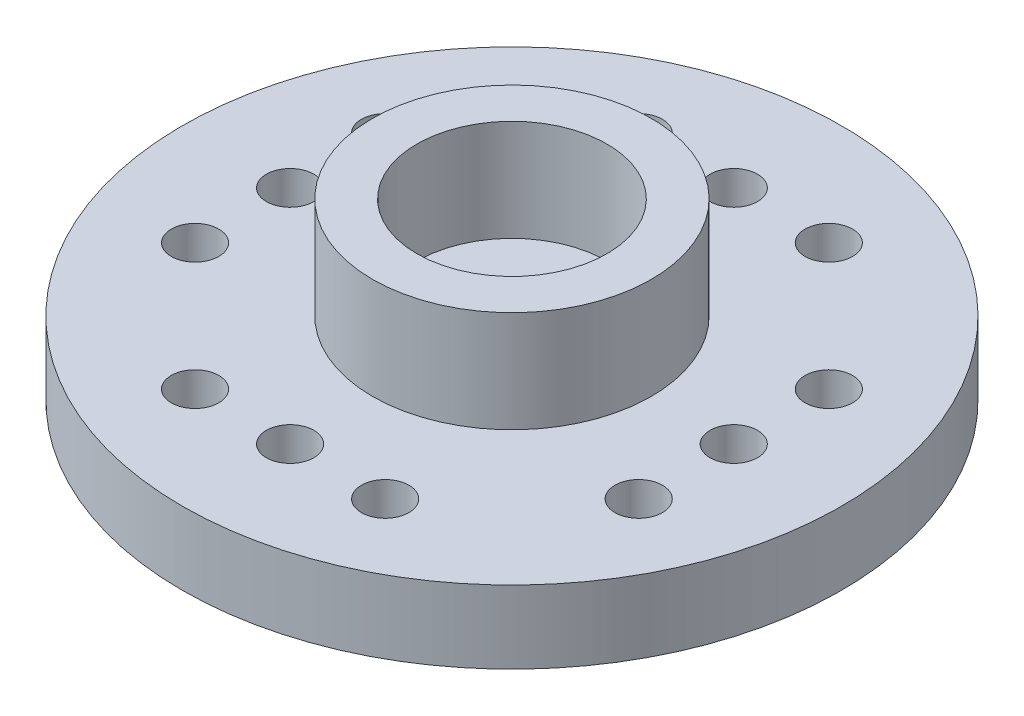
ISO-10303-21;
HEADER;
FILE_DESCRIPTION(('STEP AP214'),'2;1');
FILE_NAME('part.step','',(''),(''),'','','');
FILE_SCHEMA(('AUTOMOTIVE_DESIGN { 1 0 10303 214 1 1 1 1 }'));
ENDSEC;
DATA;
#1=APPLICATION_CONTEXT('core data for automotive mechanical design processes');
#2=APPLICATION_PROTOCOL_DEFINITION('international standard','automotive_design',2000,#1);
#3=PRODUCT_CONTEXT('',#1,'mechanical');
#4=PRODUCT('Part','Part','',(#3));
#5=PRODUCT_RELATED_PRODUCT_CATEGORY('part','',(#4));
#6=PRODUCT_DEFINITION_FORMATION('','',#4);
#7=PRODUCT_DEFINITION_CONTEXT('part definition',#1,'design');
#8=PRODUCT_DEFINITION('design','',#6,#7);
#9=PRODUCT_DEFINITION_SHAPE('','',#8);
#10=(LENGTH_UNIT() NAMED_UNIT(*) SI_UNIT(.MILLI.,.METRE.));
#11=(NAMED_UNIT(*) PLANE_ANGLE_UNIT() SI_UNIT($,.RADIAN.));
#12=(NAMED_UNIT(*) SI_UNIT($,.STERADIAN.) SOLID_ANGLE_UNIT());
#13=UNCERTAINTY_MEASURE_WITH_UNIT(LENGTH_MEASURE(1.E-05),#10,'distance_accuracy_value','');
#14=(GEOMETRIC_REPRESENTATION_CONTEXT(3) GLOBAL_UNCERTAINTY_ASSIGNED_CONTEXT((#13)) GLOBAL_UNIT_ASSIGNED_CONTEXT((#10,
#11,#12)) REPRESENTATION_CONTEXT('',''));
#15=CARTESIAN_POINT('',(0.,0.,0.));
#16=DIRECTION('',(0.,0.,1.));
#17=DIRECTION('',(1.,0.,0.));
#18=AXIS2_PLACEMENT_3D('',#15,#16,#17);
#19=CARTESIAN_POINT('',(0.,2.3,0.));
#20=DIRECTION('',(0.,1.,0.));
#21=DIRECTION('',(0.,0.,1.));
#22=AXIS2_PLACEMENT_3D('',#19,#20,#21);
#23=PLANE('',#22);
#24=CARTESIAN_POINT('',(0.,2.3,0.));
#25=DIRECTION('',(0.,1.,0.));
#26=DIRECTION('',(0.,0.,1.));
#27=AXIS2_PLACEMENT_3D('',#24,#25,#26);
#28=CIRCLE('',#27,1.5);
#29=CARTESIAN_POINT('',(0.,2.3,1.5));
#30=VERTEX_POINT('',#29);
#31=EDGE_CURVE('E150',#30,#30,#28,.T.);
#32=ORIENTED_EDGE('',*,*,#31,.F.);
#33=EDGE_LOOP('',(#32));
#34=FACE_BOUND('',#33,.T.);
#35=CARTESIAN_POINT('',(0.,2.3,0.));
#36=DIRECTION('',(0.,1.,0.));
#37=DIRECTION('',(0.,0.,1.));
#38=AXIS2_PLACEMENT_3D('',#35,#36,#37);
#39=CIRCLE('',#38,3.);
#40=CARTESIAN_POINT('',(0.,2.3,3.));
#41=VERTEX_POINT('',#40);
#42=EDGE_CURVE('E10',#41,#41,#39,.F.);
#43=ORIENTED_EDGE('',*,*,#42,.F.);
#44=EDGE_LOOP('',(#43));
#45=FACE_BOUND('',#44,.T.);
#46=ADVANCED_FACE('F37',(#34,#45),#23,.T.);
#47=CARTESIAN_POINT('',(0.,2.3,0.));
#48=DIRECTION('',(0.,1.,0.));
#49=DIRECTION('',(0.,0.,1.));
#50=AXIS2_PLACEMENT_3D('',#47,#48,#49);
#51=CIRCLE('',#50,4.4);
#52=CARTESIAN_POINT('',(0.,2.3,4.4));
#53=VERTEX_POINT('',#52);
#54=EDGE_CURVE('E162',#53,#53,#51,.T.);
#55=ORIENTED_EDGE('',*,*,#54,.F.);
#56=EDGE_LOOP('',(#55));
#57=FACE_BOUND('',#56,.T.);
#58=CARTESIAN_POINT('',(3.,2.3,-7.));
#59=DIRECTION('',(0.,1.,0.));
#60=DIRECTION('',(0.,0.,-1.));
#61=AXIS2_PLACEMENT_3D('',#58,#59,#60);
#62=CIRCLE('',#61,0.75);
#63=CARTESIAN_POINT('',(3.,2.3,-7.75));
#64=VERTEX_POINT('',#63);
#65=EDGE_CURVE('E142',#64,#64,#62,.T.);
#66=ORIENTED_EDGE('',*,*,#65,.F.);
#67=EDGE_LOOP('',(#66));
#68=FACE_BOUND('',#67,.T.);
#69=CARTESIAN_POINT('',(-3.,2.3,-7.));
#70=DIRECTION('',(0.,1.,0.));
#71=DIRECTION('',(0.,0.,-1.));
#72=AXIS2_PLACEMENT_3D('',#69,#70,#71);
#73=CIRCLE('',#72,0.750000000000002);
#74=CARTESIAN_POINT('',(-3.,2.3,-7.75));
#75=VERTEX_POINT('',#74);
#76=EDGE_CURVE('E126',#75,#75,#73,.T.);
#77=ORIENTED_EDGE('',*,*,#76,.F.);
#78=EDGE_LOOP('',(#77));
#79=FACE_BOUND('',#78,.T.);
#80=CARTESIAN_POINT('',(-7.,2.3,0.));
#81=DIRECTION('',(0.,1.,0.));
#82=DIRECTION('',(0.,0.,1.));
#83=AXIS2_PLACEMENT_3D('',#80,#81,#82);
#84=CIRCLE('',#83,0.749999999999999);
#85=CARTESIAN_POINT('',(-7.,2.3,0.750000000000004));
#86=VERTEX_POINT('',#85);
#87=EDGE_CURVE('E110',#86,#86,#84,.T.);
#88=ORIENTED_EDGE('',*,*,#87,.F.);
#89=EDGE_LOOP('',(#88));
#90=FACE_BOUND('',#89,.T.);
#91=CARTESIAN_POINT('',(-3.00000000000001,2.3,6.99999999999999));
#92=DIRECTION('',(0.,1.,0.));
#93=DIRECTION('',(0.,0.,-1.));
#94=AXIS2_PLACEMENT_3D('',#91,#92,#93);
#95=CIRCLE('',#94,0.75);
#96=CARTESIAN_POINT('',(-3.00000000000001,2.3,6.24999999999999));
#97=VERTEX_POINT('',#96);
#98=EDGE_CURVE('E94',#97,#97,#95,.T.);
#99=ORIENTED_EDGE('',*,*,#98,.F.);
#100=EDGE_LOOP('',(#99));
#101=FACE_BOUND('',#100,.T.);
#102=CARTESIAN_POINT('',(2.99999999999999,2.3,6.99999999999999));
#103=DIRECTION('',(0.,1.,0.));
#104=DIRECTION('',(0.,0.,-1.));
#105=AXIS2_PLACEMENT_3D('',#102,#103,#104);
#106=CIRCLE('',#105,0.749999999999998);
#107=CARTESIAN_POINT('',(2.99999999999999,2.3,6.24999999999999));
#108=VERTEX_POINT('',#107);
#109=EDGE_CURVE('E78',#108,#108,#106,.T.);
#110=ORIENTED_EDGE('',*,*,#109,.F.);
#111=EDGE_LOOP('',(#110));
#112=FACE_BOUND('',#111,.T.);
#113=CARTESIAN_POINT('',(7.,2.3,-3.));
#114=DIRECTION('',(0.,1.,0.));
#115=DIRECTION('',(0.,0.,1.));
#116=AXIS2_PLACEMENT_3D('',#113,#114,#115);
#117=CIRCLE('',#116,0.75);
#118=CARTESIAN_POINT('',(7.,2.3,-2.25));
#119=VERTEX_POINT('',#118);
#120=EDGE_CURVE('E62',#119,#119,#117,.T.);
#121=ORIENTED_EDGE('',*,*,#120,.F.);
#122=EDGE_LOOP('',(#121));
#123=FACE_BOUND('',#122,.T.);
#124=CARTESIAN_POINT('',(0.,2.3,0.));
#125=DIRECTION('',(0.,1.,0.));
#126=DIRECTION('',(0.,0.,1.));
#127=AXIS2_PLACEMENT_3D('',#124,#125,#126);
#128=CIRCLE('',#127,10.4);
#129=CARTESIAN_POINT('',(0.,2.3,10.4));
#130=VERTEX_POINT('',#129);
#131=EDGE_CURVE('E45',#130,#130,#128,.T.);
#132=ORIENTED_EDGE('',*,*,#131,.T.);
#133=EDGE_LOOP('',(#132));
#134=FACE_BOUND('',#133,.T.);
#135=CARTESIAN_POINT('',(7.,2.3,0.));
#136=DIRECTION('',(0.,1.,0.));
#137=DIRECTION('',(0.,0.,1.));
#138=AXIS2_PLACEMENT_3D('',#135,#136,#137);
#139=CIRCLE('',#138,0.75);
#140=CARTESIAN_POINT('',(7.,2.3,0.749999999999998));
#141=VERTEX_POINT('',#140);
#142=EDGE_CURVE('E56',#141,#141,#139,.T.);
#143=ORIENTED_EDGE('',*,*,#142,.F.);
#144=EDGE_LOOP('',(#143));
#145=FACE_BOUND('',#144,.T.);
#146=CARTESIAN_POINT('',(7.,2.3,3.));
#147=DIRECTION('',(0.,1.,0.));
#148=DIRECTION('',(0.,0.,1.));
#149=AXIS2_PLACEMENT_3D('',#146,#147,#148);
#150=CIRCLE('',#149,0.75);
#151=CARTESIAN_POINT('',(7.,2.3,3.75));
#152=VERTEX_POINT('',#151);
#153=EDGE_CURVE('E70',#152,#152,#150,.T.);
#154=ORIENTED_EDGE('',*,*,#153,.F.);
#155=EDGE_LOOP('',(#154));
#156=FACE_BOUND('',#155,.T.);
#157=CARTESIAN_POINT('',(0.,2.3,6.99999999999999));
#158=DIRECTION('',(0.,1.,0.));
#159=DIRECTION('',(0.,0.,-1.));
#160=AXIS2_PLACEMENT_3D('',#157,#158,#159);
#161=CIRCLE('',#160,0.75);
#162=CARTESIAN_POINT('',(0.,2.3,6.24999999999999));
#163=VERTEX_POINT('',#162);
#164=EDGE_CURVE('E86',#163,#163,#161,.T.);
#165=ORIENTED_EDGE('',*,*,#164,.F.);
#166=EDGE_LOOP('',(#165));
#167=FACE_BOUND('',#166,.T.);
#168=CARTESIAN_POINT('',(-7.,2.3,3.));
#169=DIRECTION('',(0.,1.,0.));
#170=DIRECTION('',(0.,0.,1.));
#171=AXIS2_PLACEMENT_3D('',#168,#169,#170);
#172=CIRCLE('',#171,0.749999999999999);
#173=CARTESIAN_POINT('',(-7.,2.3,3.75));
#174=VERTEX_POINT('',#173);
#175=EDGE_CURVE('E102',#174,#174,#172,.T.);
#176=ORIENTED_EDGE('',*,*,#175,.F.);
#177=EDGE_LOOP('',(#176));
#178=FACE_BOUND('',#177,.T.);
#179=CARTESIAN_POINT('',(-6.99999999999999,2.3,-2.99999999999999));
#180=DIRECTION('',(0.,1.,0.));
#181=DIRECTION('',(0.,0.,1.));
#182=AXIS2_PLACEMENT_3D('',#179,#180,#181);
#183=CIRCLE('',#182,0.749999999999998);
#184=CARTESIAN_POINT('',(-6.99999999999999,2.3,-2.25));
#185=VERTEX_POINT('',#184);
#186=EDGE_CURVE('E118',#185,#185,#183,.T.);
#187=ORIENTED_EDGE('',*,*,#186,.F.);
#188=EDGE_LOOP('',(#187));
#189=FACE_BOUND('',#188,.T.);
#190=CARTESIAN_POINT('',(0.,2.3,-7.));
#191=DIRECTION('',(0.,1.,0.));
#192=DIRECTION('',(0.,0.,-1.));
#193=AXIS2_PLACEMENT_3D('',#190,#191,#192);
#194=CIRCLE('',#193,0.749999999999998);
#195=CARTESIAN_POINT('',(0.,2.3,-7.75));
#196=VERTEX_POINT('',#195);
#197=EDGE_CURVE('E134',#196,#196,#194,.T.);
#198=ORIENTED_EDGE('',*,*,#197,.F.);
#199=EDGE_LOOP('',(#198));
#200=FACE_BOUND('',#199,.T.);
#201=ADVANCED_FACE('F193',(#57,#68,#79,#90,#101,#112,#123,#134,#145,#156,#167,#178,#189,#200),
#23,.T.);
#202=CARTESIAN_POINT('',(0.,0.,0.));
#203=DIRECTION('',(0.,1.,0.));
#204=DIRECTION('',(0.,0.,1.));
#205=AXIS2_PLACEMENT_3D('',#202,#203,#204);
#206=PLANE('',#205);
#207=CARTESIAN_POINT('',(0.,0.,0.));
#208=DIRECTION('',(0.,1.,0.));
#209=DIRECTION('',(0.,0.,1.));
#210=AXIS2_PLACEMENT_3D('',#207,#208,#209);
#211=CIRCLE('',#210,10.4);
#212=CARTESIAN_POINT('',(0.,0.,10.4));
#213=VERTEX_POINT('',#212);
#214=EDGE_CURVE('E50',#213,#213,#211,.T.);
#215=ORIENTED_EDGE('',*,*,#214,.F.);
#216=EDGE_LOOP('',(#215));
#217=FACE_BOUND('',#216,.T.);
#218=CARTESIAN_POINT('',(7.,0.,0.));
#219=DIRECTION('',(0.,1.,0.));
#220=DIRECTION('',(0.,0.,1.));
#221=AXIS2_PLACEMENT_3D('',#218,#219,#220);
#222=CIRCLE('',#221,0.75);
#223=CARTESIAN_POINT('',(7.,0.,0.749999999999998));
#224=VERTEX_POINT('',#223);
#225=EDGE_CURVE('E58',#224,#224,#222,.T.);
#226=ORIENTED_EDGE('',*,*,#225,.T.);
#227=EDGE_LOOP('',(#226));
#228=FACE_BOUND('',#227,.T.);
#229=CARTESIAN_POINT('',(7.,0.,-3.));
#230=DIRECTION('',(0.,1.,0.));
#231=DIRECTION('',(0.,0.,1.));
#232=AXIS2_PLACEMENT_3D('',#229,#230,#231);
#233=CIRCLE('',#232,0.75);
#234=CARTESIAN_POINT('',(7.,0.,-2.25));
#235=VERTEX_POINT('',#234);
#236=EDGE_CURVE('E66',#235,#235,#233,.T.);
#237=ORIENTED_EDGE('',*,*,#236,.T.);
#238=EDGE_LOOP('',(#237));
#239=FACE_BOUND('',#238,.T.);
#240=CARTESIAN_POINT('',(7.,0.,3.));
#241=DIRECTION('',(0.,1.,0.));
#242=DIRECTION('',(0.,0.,1.));
#243=AXIS2_PLACEMENT_3D('',#240,#241,#242);
#244=CIRCLE('',#243,0.75);
#245=CARTESIAN_POINT('',(7.,0.,3.75));
#246=VERTEX_POINT('',#245);
#247=EDGE_CURVE('E74',#246,#246,#244,.T.);
#248=ORIENTED_EDGE('',*,*,#247,.T.);
#249=EDGE_LOOP('',(#248));
#250=FACE_BOUND('',#249,.T.);
#251=CARTESIAN_POINT('',(2.99999999999999,0.,6.99999999999999));
#252=DIRECTION('',(0.,1.,0.));
#253=DIRECTION('',(0.,0.,-1.));
#254=AXIS2_PLACEMENT_3D('',#251,#252,#253);
#255=CIRCLE('',#254,0.749999999999998);
#256=CARTESIAN_POINT('',(2.99999999999999,0.,6.24999999999999));
#257=VERTEX_POINT('',#256);
#258=EDGE_CURVE('E82',#257,#257,#255,.T.);
#259=ORIENTED_EDGE('',*,*,#258,.T.);
#260=EDGE_LOOP('',(#259));
#261=FACE_BOUND('',#260,.T.);
#262=CARTESIAN_POINT('',(0.,0.,6.99999999999999));
#263=DIRECTION('',(0.,1.,0.));
#264=DIRECTION('',(0.,0.,-1.));
#265=AXIS2_PLACEMENT_3D('',#262,#263,#264);
#266=CIRCLE('',#265,0.75);
#267=CARTESIAN_POINT('',(0.,0.,6.24999999999999));
#268=VERTEX_POINT('',#267);
#269=EDGE_CURVE('E90',#268,#268,#266,.T.);
#270=ORIENTED_EDGE('',*,*,#269,.T.);
#271=EDGE_LOOP('',(#270));
#272=FACE_BOUND('',#271,.T.);
#273=CARTESIAN_POINT('',(-3.00000000000001,0.,6.99999999999999));
#274=DIRECTION('',(0.,1.,0.));
#275=DIRECTION('',(0.,0.,-1.));
#276=AXIS2_PLACEMENT_3D('',#273,#274,#275);
#277=CIRCLE('',#276,0.75);
#278=CARTESIAN_POINT('',(-3.00000000000001,0.,6.24999999999999));
#279=VERTEX_POINT('',#278);
#280=EDGE_CURVE('E98',#279,#279,#277,.T.);
#281=ORIENTED_EDGE('',*,*,#280,.T.);
#282=EDGE_LOOP('',(#281));
#283=FACE_BOUND('',#282,.T.);
#284=CARTESIAN_POINT('',(-7.,0.,3.));
#285=DIRECTION('',(0.,1.,0.));
#286=DIRECTION('',(0.,0.,1.));
#287=AXIS2_PLACEMENT_3D('',#284,#285,#286);
#288=CIRCLE('',#287,0.749999999999999);
#289=CARTESIAN_POINT('',(-7.,0.,3.75));
#290=VERTEX_POINT('',#289);
#291=EDGE_CURVE('E106',#290,#290,#288,.T.);
#292=ORIENTED_EDGE('',*,*,#291,.T.);
#293=EDGE_LOOP('',(#292));
#294=FACE_BOUND('',#293,.T.);
#295=CARTESIAN_POINT('',(-7.,0.,0.));
#296=DIRECTION('',(0.,1.,0.));
#297=DIRECTION('',(0.,0.,1.));
#298=AXIS2_PLACEMENT_3D('',#295,#296,#297);
#299=CIRCLE('',#298,0.749999999999999);
#300=CARTESIAN_POINT('',(-7.,0.,0.750000000000004));
#301=VERTEX_POINT('',#300);
#302=EDGE_CURVE('E114',#301,#301,#299,.T.);
#303=ORIENTED_EDGE('',*,*,#302,.T.);
#304=EDGE_LOOP('',(#303));
#305=FACE_BOUND('',#304,.T.);
#306=CARTESIAN_POINT('',(-6.99999999999999,0.,-2.99999999999999));
#307=DIRECTION('',(0.,1.,0.));
#308=DIRECTION('',(0.,0.,1.));
#309=AXIS2_PLACEMENT_3D('',#306,#307,#308);
#310=CIRCLE('',#309,0.749999999999998);
#311=CARTESIAN_POINT('',(-6.99999999999999,0.,-2.25));
#312=VERTEX_POINT('',#311);
#313=EDGE_CURVE('E122',#312,#312,#310,.T.);
#314=ORIENTED_EDGE('',*,*,#313,.T.);
#315=EDGE_LOOP('',(#314));
#316=FACE_BOUND('',#315,.T.);
#317=CARTESIAN_POINT('',(-3.,0.,-7.));
#318=DIRECTION('',(0.,1.,0.));
#319=DIRECTION('',(0.,0.,-1.));
#320=AXIS2_PLACEMENT_3D('',#317,#318,#319);
#321=CIRCLE('',#320,0.750000000000002);
#322=CARTESIAN_POINT('',(-3.,0.,-7.75));
#323=VERTEX_POINT('',#322);
#324=EDGE_CURVE('E130',#323,#323,#321,.T.);
#325=ORIENTED_EDGE('',*,*,#324,.T.);
#326=EDGE_LOOP('',(#325));
#327=FACE_BOUND('',#326,.T.);
#328=CARTESIAN_POINT('',(0.,0.,-7.));
#329=DIRECTION('',(0.,1.,0.));
#330=DIRECTION('',(0.,0.,-1.));
#331=AXIS2_PLACEMENT_3D('',#328,#329,#330);
#332=CIRCLE('',#331,0.749999999999998);
#333=CARTESIAN_POINT('',(0.,0.,-7.75));
#334=VERTEX_POINT('',#333);
#335=EDGE_CURVE('E138',#334,#334,#332,.T.);
#336=ORIENTED_EDGE('',*,*,#335,.T.);
#337=EDGE_LOOP('',(#336));
#338=FACE_BOUND('',#337,.T.);
#339=CARTESIAN_POINT('',(3.,0.,-7.));
#340=DIRECTION('',(0.,1.,0.));
#341=DIRECTION('',(0.,0.,-1.));
#342=AXIS2_PLACEMENT_3D('',#339,#340,#341);
#343=CIRCLE('',#342,0.75);
#344=CARTESIAN_POINT('',(3.,0.,-7.75));
#345=VERTEX_POINT('',#344);
#346=EDGE_CURVE('E146',#345,#345,#343,.T.);
#347=ORIENTED_EDGE('',*,*,#346,.T.);
#348=EDGE_LOOP('',(#347));
#349=FACE_BOUND('',#348,.T.);
#350=CARTESIAN_POINT('',(0.,0.,0.));
#351=DIRECTION('',(0.,1.,0.));
#352=DIRECTION('',(0.,0.,1.));
#353=AXIS2_PLACEMENT_3D('',#350,#351,#352);
#354=CIRCLE('',#353,1.5);
#355=CARTESIAN_POINT('',(0.,0.,1.5));
#356=VERTEX_POINT('',#355);
#357=EDGE_CURVE('E154',#356,#356,#354,.T.);
#358=ORIENTED_EDGE('',*,*,#357,.T.);
#359=EDGE_LOOP('',(#358));
#360=FACE_BOUND('',#359,.T.);
#361=ADVANCED_FACE('F199',(#217,#228,#239,#250,#261,#272,#283,#294,#305,#316,#327,#338,#349,
#360),#206,.F.);
#362=CARTESIAN_POINT('',(0.,2.3,0.));
#363=DIRECTION('',(0.,-1.,0.));
#364=DIRECTION('',(0.,0.,-1.));
#365=AXIS2_PLACEMENT_3D('',#362,#363,#364);
#366=CYLINDRICAL_SURFACE('',#365,10.4);
#367=ORIENTED_EDGE('',*,*,#131,.F.);
#368=EDGE_LOOP('',(#367));
#369=FACE_BOUND('',#368,.T.);
#370=ORIENTED_EDGE('',*,*,#214,.T.);
#371=EDGE_LOOP('',(#370));
#372=FACE_BOUND('',#371,.T.);
#373=ADVANCED_FACE('F39',(#369,#372),#366,.T.);
#374=CARTESIAN_POINT('',(7.,2.3,0.));
#375=DIRECTION('',(0.,-1.,0.));
#376=DIRECTION('',(0.,0.,-1.));
#377=AXIS2_PLACEMENT_3D('',#374,#375,#376);
#378=CYLINDRICAL_SURFACE('',#377,0.75);
#379=ORIENTED_EDGE('',*,*,#142,.T.);
#380=EDGE_LOOP('',(#379));
#381=FACE_BOUND('',#380,.T.);
#382=ORIENTED_EDGE('',*,*,#225,.F.);
#383=EDGE_LOOP('',(#382));
#384=FACE_BOUND('',#383,.T.);
#385=ADVANCED_FACE('F204',(#381,#384),#378,.F.);
#386=CARTESIAN_POINT('',(7.,2.3,-3.));
#387=DIRECTION('',(0.,-1.,0.));
#388=DIRECTION('',(0.,0.,-1.));
#389=AXIS2_PLACEMENT_3D('',#386,#387,#388);
#390=CYLINDRICAL_SURFACE('',#389,0.75);
#391=ORIENTED_EDGE('',*,*,#120,.T.);
#392=EDGE_LOOP('',(#391));
#393=FACE_BOUND('',#392,.T.);
#394=ORIENTED_EDGE('',*,*,#236,.F.);
#395=EDGE_LOOP('',(#394));
#396=FACE_BOUND('',#395,.T.);
#397=ADVANCED_FACE('F281',(#393,#396),#390,.F.);
#398=CARTESIAN_POINT('',(7.,2.3,3.));
#399=DIRECTION('',(0.,-1.,0.));
#400=DIRECTION('',(0.,0.,-1.));
#401=AXIS2_PLACEMENT_3D('',#398,#399,#400);
#402=CYLINDRICAL_SURFACE('',#401,0.75);
#403=ORIENTED_EDGE('',*,*,#153,.T.);
#404=EDGE_LOOP('',(#403));
#405=FACE_BOUND('',#404,.T.);
#406=ORIENTED_EDGE('',*,*,#247,.F.);
#407=EDGE_LOOP('',(#406));
#408=FACE_BOUND('',#407,.T.);
#409=ADVANCED_FACE('F278',(#405,#408),#402,.F.);
#410=CARTESIAN_POINT('',(2.99999999999999,2.3,6.99999999999999));
#411=DIRECTION('',(0.,-1.,0.));
#412=DIRECTION('',(0.,0.,-1.));
#413=AXIS2_PLACEMENT_3D('',#410,#411,#412);
#414=CYLINDRICAL_SURFACE('',#413,0.749999999999998);
#415=ORIENTED_EDGE('',*,*,#109,.T.);
#416=EDGE_LOOP('',(#415));
#417=FACE_BOUND('',#416,.T.);
#418=ORIENTED_EDGE('',*,*,#258,.F.);
#419=EDGE_LOOP('',(#418));
#420=FACE_BOUND('',#419,.T.);
#421=ADVANCED_FACE('F274',(#417,#420),#414,.F.);
#422=CARTESIAN_POINT('',(0.,2.3,6.99999999999999));
#423=DIRECTION('',(0.,-1.,0.));
#424=DIRECTION('',(0.,0.,-1.));
#425=AXIS2_PLACEMENT_3D('',#422,#423,#424);
#426=CYLINDRICAL_SURFACE('',#425,0.75);
#427=ORIENTED_EDGE('',*,*,#164,.T.);
#428=EDGE_LOOP('',(#427));
#429=FACE_BOUND('',#428,.T.);
#430=ORIENTED_EDGE('',*,*,#269,.F.);
#431=EDGE_LOOP('',(#430));
#432=FACE_BOUND('',#431,.T.);
#433=ADVANCED_FACE('F270',(#429,#432),#426,.F.);
#434=CARTESIAN_POINT('',(-3.00000000000001,2.3,6.99999999999999));
#435=DIRECTION('',(0.,-1.,0.));
#436=DIRECTION('',(0.,0.,-1.));
#437=AXIS2_PLACEMENT_3D('',#434,#435,#436);
#438=CYLINDRICAL_SURFACE('',#437,0.75);
#439=ORIENTED_EDGE('',*,*,#98,.T.);
#440=EDGE_LOOP('',(#439));
#441=FACE_BOUND('',#440,.T.);
#442=ORIENTED_EDGE('',*,*,#280,.F.);
#443=EDGE_LOOP('',(#442));
#444=FACE_BOUND('',#443,.T.);
#445=ADVANCED_FACE('F266',(#441,#444),#438,.F.);
#446=CARTESIAN_POINT('',(-7.,2.3,3.));
#447=DIRECTION('',(0.,-1.,0.));
#448=DIRECTION('',(0.,0.,-1.));
#449=AXIS2_PLACEMENT_3D('',#446,#447,#448);
#450=CYLINDRICAL_SURFACE('',#449,0.749999999999999);
#451=ORIENTED_EDGE('',*,*,#175,.T.);
#452=EDGE_LOOP('',(#451));
#453=FACE_BOUND('',#452,.T.);
#454=ORIENTED_EDGE('',*,*,#291,.F.);
#455=EDGE_LOOP('',(#454));
#456=FACE_BOUND('',#455,.T.);
#457=ADVANCED_FACE('F262',(#453,#456),#450,.F.);
#458=CARTESIAN_POINT('',(-7.,2.3,0.));
#459=DIRECTION('',(0.,-1.,0.));
#460=DIRECTION('',(0.,0.,-1.));
#461=AXIS2_PLACEMENT_3D('',#458,#459,#460);
#462=CYLINDRICAL_SURFACE('',#461,0.749999999999999);
#463=ORIENTED_EDGE('',*,*,#87,.T.);
#464=EDGE_LOOP('',(#463));
#465=FACE_BOUND('',#464,.T.);
#466=ORIENTED_EDGE('',*,*,#302,.F.);
#467=EDGE_LOOP('',(#466));
#468=FACE_BOUND('',#467,.T.);
#469=ADVANCED_FACE('F258',(#465,#468),#462,.F.);
#470=CARTESIAN_POINT('',(-6.99999999999999,2.3,-2.99999999999999));
#471=DIRECTION('',(0.,-1.,0.));
#472=DIRECTION('',(0.,0.,-1.));
#473=AXIS2_PLACEMENT_3D('',#470,#471,#472);
#474=CYLINDRICAL_SURFACE('',#473,0.749999999999998);
#475=ORIENTED_EDGE('',*,*,#186,.T.);
#476=EDGE_LOOP('',(#475));
#477=FACE_BOUND('',#476,.T.);
#478=ORIENTED_EDGE('',*,*,#313,.F.);
#479=EDGE_LOOP('',(#478));
#480=FACE_BOUND('',#479,.T.);
#481=ADVANCED_FACE('F254',(#477,#480),#474,.F.);
#482=CARTESIAN_POINT('',(-3.,2.3,-7.));
#483=DIRECTION('',(0.,-1.,0.));
#484=DIRECTION('',(0.,0.,-1.));
#485=AXIS2_PLACEMENT_3D('',#482,#483,#484);
#486=CYLINDRICAL_SURFACE('',#485,0.750000000000002);
#487=ORIENTED_EDGE('',*,*,#76,.T.);
#488=EDGE_LOOP('',(#487));
#489=FACE_BOUND('',#488,.T.);
#490=ORIENTED_EDGE('',*,*,#324,.F.);
#491=EDGE_LOOP('',(#490));
#492=FACE_BOUND('',#491,.T.);
#493=ADVANCED_FACE('F248',(#489,#492),#486,.F.);
#494=CARTESIAN_POINT('',(0.,2.3,-7.));
#495=DIRECTION('',(0.,-1.,0.));
#496=DIRECTION('',(0.,0.,-1.));
#497=AXIS2_PLACEMENT_3D('',#494,#495,#496);
#498=CYLINDRICAL_SURFACE('',#497,0.749999999999998);
#499=ORIENTED_EDGE('',*,*,#197,.T.);
#500=EDGE_LOOP('',(#499));
#501=FACE_BOUND('',#500,.T.);
#502=ORIENTED_EDGE('',*,*,#335,.F.);
#503=EDGE_LOOP('',(#502));
#504=FACE_BOUND('',#503,.T.);
#505=ADVANCED_FACE('F242',(#501,#504),#498,.F.);
#506=CARTESIAN_POINT('',(3.,2.3,-7.));
#507=DIRECTION('',(0.,-1.,0.));
#508=DIRECTION('',(0.,0.,-1.));
#509=AXIS2_PLACEMENT_3D('',#506,#507,#508);
#510=CYLINDRICAL_SURFACE('',#509,0.75);
#511=ORIENTED_EDGE('',*,*,#65,.T.);
#512=EDGE_LOOP('',(#511));
#513=FACE_BOUND('',#512,.T.);
#514=ORIENTED_EDGE('',*,*,#346,.F.);
#515=EDGE_LOOP('',(#514));
#516=FACE_BOUND('',#515,.T.);
#517=ADVANCED_FACE('F188',(#513,#516),#510,.F.);
#518=CARTESIAN_POINT('',(0.,2.3,0.));
#519=DIRECTION('',(0.,-1.,0.));
#520=DIRECTION('',(0.,0.,-1.));
#521=AXIS2_PLACEMENT_3D('',#518,#519,#520);
#522=CYLINDRICAL_SURFACE('',#521,1.5);
#523=ORIENTED_EDGE('',*,*,#31,.T.);
#524=EDGE_LOOP('',(#523));
#525=FACE_BOUND('',#524,.T.);
#526=ORIENTED_EDGE('',*,*,#357,.F.);
#527=EDGE_LOOP('',(#526));
#528=FACE_BOUND('',#527,.T.);
#529=ADVANCED_FACE('F179',(#525,#528),#522,.F.);
#530=CARTESIAN_POINT('',(0.,5.5,0.));
#531=DIRECTION('',(0.,1.,0.));
#532=DIRECTION('',(0.,0.,1.));
#533=AXIS2_PLACEMENT_3D('',#530,#531,#532);
#534=PLANE('',#533);
#535=CARTESIAN_POINT('',(0.,5.5,0.));
#536=DIRECTION('',(0.,1.,0.));
#537=DIRECTION('',(0.,0.,1.));
#538=AXIS2_PLACEMENT_3D('',#535,#536,#537);
#539=CIRCLE('',#538,4.4);
#540=CARTESIAN_POINT('',(0.,5.5,4.4));
#541=VERTEX_POINT('',#540);
#542=EDGE_CURVE('E158',#541,#541,#539,.T.);
#543=ORIENTED_EDGE('',*,*,#542,.T.);
#544=EDGE_LOOP('',(#543));
#545=FACE_BOUND('',#544,.T.);
#546=CARTESIAN_POINT('',(0.,5.5,0.));
#547=DIRECTION('',(0.,1.,0.));
#548=DIRECTION('',(0.,0.,1.));
#549=AXIS2_PLACEMENT_3D('',#546,#547,#548);
#550=CIRCLE('',#549,3.);
#551=CARTESIAN_POINT('',(0.,5.5,3.));
#552=VERTEX_POINT('',#551);
#553=EDGE_CURVE('E166',#552,#552,#550,.T.);
#554=ORIENTED_EDGE('',*,*,#553,.F.);
#555=EDGE_LOOP('',(#554));
#556=FACE_BOUND('',#555,.T.);
#557=ADVANCED_FACE('F176',(#545,#556),#534,.T.);
#558=CARTESIAN_POINT('',(0.,5.5,0.));
#559=DIRECTION('',(0.,-1.,0.));
#560=DIRECTION('',(0.,0.,-1.));
#561=AXIS2_PLACEMENT_3D('',#558,#559,#560);
#562=CYLINDRICAL_SURFACE('',#561,4.4);
#563=ORIENTED_EDGE('',*,*,#542,.F.);
#564=EDGE_LOOP('',(#563));
#565=FACE_BOUND('',#564,.T.);
#566=ORIENTED_EDGE('',*,*,#54,.T.);
#567=EDGE_LOOP('',(#566));
#568=FACE_BOUND('',#567,.T.);
#569=ADVANCED_FACE('F178',(#565,#568),#562,.T.);
#570=CARTESIAN_POINT('',(0.,5.5,0.));
#571=DIRECTION('',(0.,-1.,0.));
#572=DIRECTION('',(0.,0.,-1.));
#573=AXIS2_PLACEMENT_3D('',#570,#571,#572);
#574=CYLINDRICAL_SURFACE('',#573,3.);
#575=ORIENTED_EDGE('',*,*,#553,.T.);
#576=EDGE_LOOP('',(#575));
#577=FACE_BOUND('',#576,.T.);
#578=ORIENTED_EDGE('',*,*,#42,.T.);
#579=EDGE_LOOP('',(#578));
#580=FACE_BOUND('',#579,.T.);
#581=ADVANCED_FACE('F174',(#577,#580),#574,.F.);
#582=CLOSED_SHELL('',(#46,#201,#361,#373,#385,#397,#409,#421,#433,#445,#457,#469,#481,#493,#505,
#517,#529,#557,#569,#581));
#583=MANIFOLD_SOLID_BREP('B2',#582);
#584=ADVANCED_BREP_SHAPE_REPRESENTATION('',(#18,#583),#14);
#585=SHAPE_DEFINITION_REPRESENTATION(#9,#584);
ENDSEC;
END-ISO-10303-21;
